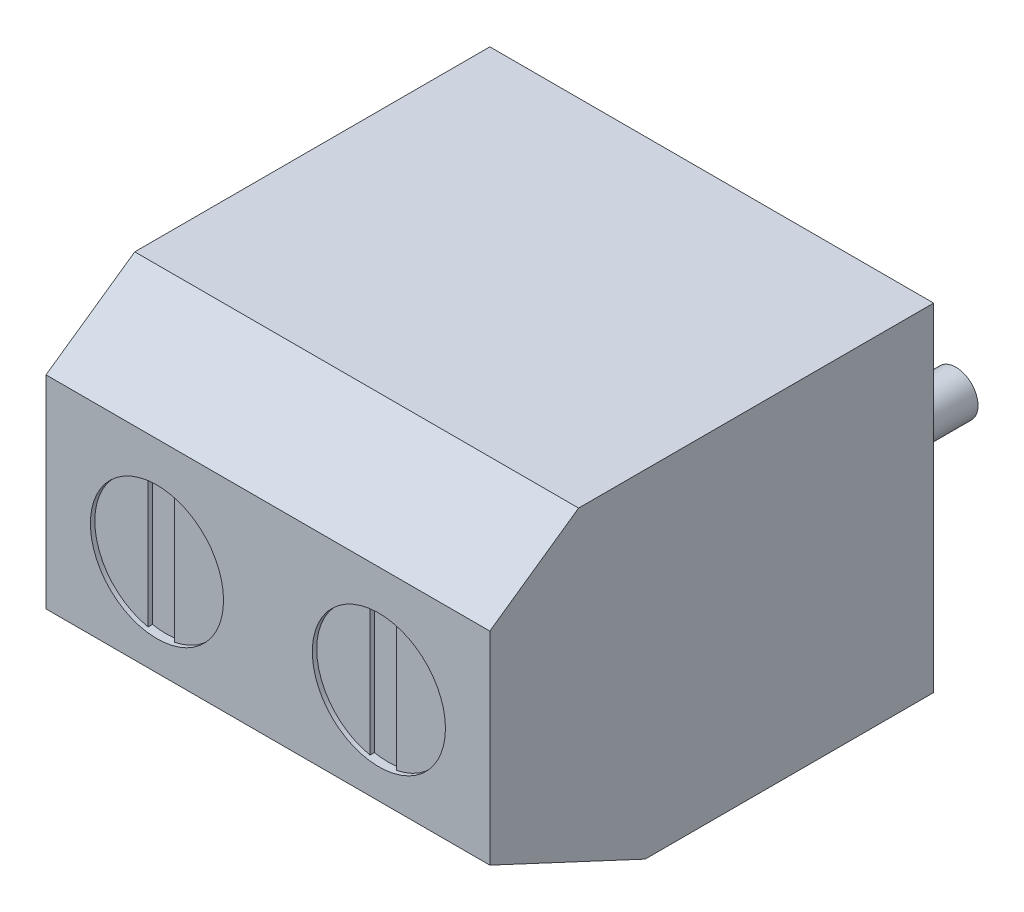
ISO-10303-21;
HEADER;
FILE_DESCRIPTION(('STEP AP214'),'2;1');
FILE_NAME('part.step','',(''),(''),'','','');
FILE_SCHEMA(('AUTOMOTIVE_DESIGN { 1 0 10303 214 1 1 1 1 }'));
ENDSEC;
DATA;
#1=APPLICATION_CONTEXT('core data for automotive mechanical design processes');
#2=APPLICATION_PROTOCOL_DEFINITION('international standard','automotive_design',2000,#1);
#3=PRODUCT_CONTEXT('',#1,'mechanical');
#4=PRODUCT('Part','Part','',(#3));
#5=PRODUCT_RELATED_PRODUCT_CATEGORY('part','',(#4));
#6=PRODUCT_DEFINITION_FORMATION('','',#4);
#7=PRODUCT_DEFINITION_CONTEXT('part definition',#1,'design');
#8=PRODUCT_DEFINITION('design','',#6,#7);
#9=PRODUCT_DEFINITION_SHAPE('','',#8);
#10=(LENGTH_UNIT() NAMED_UNIT(*) SI_UNIT(.MILLI.,.METRE.));
#11=(NAMED_UNIT(*) PLANE_ANGLE_UNIT() SI_UNIT($,.RADIAN.));
#12=(NAMED_UNIT(*) SI_UNIT($,.STERADIAN.) SOLID_ANGLE_UNIT());
#13=UNCERTAINTY_MEASURE_WITH_UNIT(LENGTH_MEASURE(1.E-05),#10,'distance_accuracy_value','');
#14=(GEOMETRIC_REPRESENTATION_CONTEXT(3) GLOBAL_UNCERTAINTY_ASSIGNED_CONTEXT((#13)) GLOBAL_UNIT_ASSIGNED_CONTEXT((#10,
#11,#12)) REPRESENTATION_CONTEXT('',''));
#15=CARTESIAN_POINT('',(0.,0.,0.));
#16=DIRECTION('',(0.,0.,1.));
#17=DIRECTION('',(1.,0.,0.));
#18=AXIS2_PLACEMENT_3D('',#15,#16,#17);
#19=CARTESIAN_POINT('',(-2.5,0.,9.9));
#20=DIRECTION('',(0.,0.,1.));
#21=DIRECTION('',(1.,0.,0.));
#22=AXIS2_PLACEMENT_3D('',#19,#20,#21);
#23=PLANE('',#22);
#24=DIRECTION('',(0.,1.,0.));
#25=VECTOR('',#24,1.);
#26=CARTESIAN_POINT('',(-2.2,-1.46969384566991,9.9));
#27=LINE('',#26,#25);
#28=CARTESIAN_POINT('',(-2.2,-1.46969384566991,9.9));
#29=VERTEX_POINT('',#28);
#30=CARTESIAN_POINT('',(-2.2,1.46969384566991,9.9));
#31=VERTEX_POINT('',#30);
#32=EDGE_CURVE('E233',#29,#31,#27,.T.);
#33=ORIENTED_EDGE('',*,*,#32,.F.);
#34=CARTESIAN_POINT('',(-2.5,0.,9.9));
#35=DIRECTION('',(0.,0.,1.));
#36=DIRECTION('',(1.,0.,0.));
#37=AXIS2_PLACEMENT_3D('',#34,#35,#36);
#38=CIRCLE('',#37,1.5);
#39=EDGE_CURVE('E255',#29,#31,#38,.T.);
#40=ORIENTED_EDGE('',*,*,#39,.T.);
#41=EDGE_LOOP('',(#33,#40));
#42=FACE_BOUND('',#41,.T.);
#43=ADVANCED_FACE('F35',(#42),#23,.T.);
#44=CARTESIAN_POINT('',(2.5,0.,9.9));
#45=DIRECTION('',(0.,0.,1.));
#46=DIRECTION('',(1.,0.,0.));
#47=AXIS2_PLACEMENT_3D('',#44,#45,#46);
#48=PLANE('',#47);
#49=DIRECTION('',(0.,1.,0.));
#50=VECTOR('',#49,1.);
#51=CARTESIAN_POINT('',(2.8,-1.46969384566991,9.9));
#52=LINE('',#51,#50);
#53=CARTESIAN_POINT('',(2.8,-1.46969384566991,9.9));
#54=VERTEX_POINT('',#53);
#55=CARTESIAN_POINT('',(2.8,1.46969384566991,9.9));
#56=VERTEX_POINT('',#55);
#57=EDGE_CURVE('E304',#54,#56,#52,.T.);
#58=ORIENTED_EDGE('',*,*,#57,.F.);
#59=CARTESIAN_POINT('',(2.5,0.,9.9));
#60=DIRECTION('',(0.,0.,1.));
#61=DIRECTION('',(1.,0.,0.));
#62=AXIS2_PLACEMENT_3D('',#59,#60,#61);
#63=CIRCLE('',#62,1.5);
#64=EDGE_CURVE('E326',#54,#56,#63,.T.);
#65=ORIENTED_EDGE('',*,*,#64,.T.);
#66=EDGE_LOOP('',(#58,#65));
#67=FACE_BOUND('',#66,.T.);
#68=ADVANCED_FACE('F392',(#67),#48,.T.);
#69=CARTESIAN_POINT('',(5.,-3.8,10.));
#70=DIRECTION('',(-1.,0.,0.));
#71=DIRECTION('',(0.,0.,1.));
#72=AXIS2_PLACEMENT_3D('',#69,#70,#71);
#73=PLANE('',#72);
#74=DIRECTION('',(0.,0.,-1.));
#75=VECTOR('',#74,1.);
#76=CARTESIAN_POINT('',(5.,3.8,10.));
#77=LINE('',#76,#75);
#78=CARTESIAN_POINT('',(5.,3.8,7.99999999999999));
#79=VERTEX_POINT('',#78);
#80=CARTESIAN_POINT('',(5.,3.8,0.));
#81=VERTEX_POINT('',#80);
#82=EDGE_CURVE('E355',#79,#81,#77,.T.);
#83=ORIENTED_EDGE('',*,*,#82,.F.);
#84=DIRECTION('',(0.,0.573576436351044,-0.819152044288993));
#85=VECTOR('',#84,1.);
#86=CARTESIAN_POINT('',(5.,2.39958492358058,10.));
#87=LINE('',#86,#85);
#88=CARTESIAN_POINT('',(5.,2.39958492358058,10.));
#89=VERTEX_POINT('',#88);
#90=EDGE_CURVE('E11',#79,#89,#87,.F.);
#91=ORIENTED_EDGE('',*,*,#90,.T.);
#92=DIRECTION('',(0.,1.,0.));
#93=VECTOR('',#92,1.);
#94=CARTESIAN_POINT('',(5.,-3.8,10.));
#95=LINE('',#94,#93);
#96=CARTESIAN_POINT('',(5.,-2.1679231964575,10.));
#97=VERTEX_POINT('',#96);
#98=EDGE_CURVE('E332',#97,#89,#95,.T.);
#99=ORIENTED_EDGE('',*,*,#98,.F.);
#100=DIRECTION('',(0.,0.422618261740697,0.906307787036651));
#101=VECTOR('',#100,1.);
#102=CARTESIAN_POINT('',(5.,-2.1679231964575,10.));
#103=LINE('',#102,#101);
#104=CARTESIAN_POINT('',(5.,-3.8,6.49999999999997));
#105=VERTEX_POINT('',#104);
#106=EDGE_CURVE('E360',#97,#105,#103,.F.);
#107=ORIENTED_EDGE('',*,*,#106,.T.);
#108=DIRECTION('',(0.,0.,-1.));
#109=VECTOR('',#108,1.);
#110=CARTESIAN_POINT('',(5.,-3.8,10.));
#111=LINE('',#110,#109);
#112=CARTESIAN_POINT('',(5.,-3.8,0.));
#113=VERTEX_POINT('',#112);
#114=EDGE_CURVE('E338',#105,#113,#111,.T.);
#115=ORIENTED_EDGE('',*,*,#114,.T.);
#116=DIRECTION('',(0.,1.,0.));
#117=VECTOR('',#116,1.);
#118=CARTESIAN_POINT('',(5.,-3.8,0.));
#119=LINE('',#118,#117);
#120=EDGE_CURVE('E339',#113,#81,#119,.T.);
#121=ORIENTED_EDGE('',*,*,#120,.T.);
#122=EDGE_LOOP('',(#83,#91,#99,#107,#115,#121));
#123=FACE_BOUND('',#122,.T.);
#124=ADVANCED_FACE('F384',(#123),#73,.F.);
#125=CARTESIAN_POINT('',(-5.,3.8,10.));
#126=DIRECTION('',(0.,-1.,0.));
#127=DIRECTION('',(0.,0.,-1.));
#128=AXIS2_PLACEMENT_3D('',#125,#126,#127);
#129=PLANE('',#128);
#130=DIRECTION('',(0.,0.,-1.));
#131=VECTOR('',#130,1.);
#132=CARTESIAN_POINT('',(-5.,3.8,10.));
#133=LINE('',#132,#131);
#134=CARTESIAN_POINT('',(-5.,3.8,7.99999999999999));
#135=VERTEX_POINT('',#134);
#136=CARTESIAN_POINT('',(-5.,3.8,0.));
#137=VERTEX_POINT('',#136);
#138=EDGE_CURVE('E353',#135,#137,#133,.T.);
#139=ORIENTED_EDGE('',*,*,#138,.F.);
#140=DIRECTION('',(1.,0.,0.));
#141=VECTOR('',#140,1.);
#142=CARTESIAN_POINT('',(-5.,3.8,7.99999999999999));
#143=LINE('',#142,#141);
#144=EDGE_CURVE('E43',#135,#79,#143,.T.);
#145=ORIENTED_EDGE('',*,*,#144,.T.);
#146=ORIENTED_EDGE('',*,*,#82,.T.);
#147=DIRECTION('',(-1.,0.,0.));
#148=VECTOR('',#147,1.);
#149=CARTESIAN_POINT('',(-5.,3.8,0.));
#150=LINE('',#149,#148);
#151=EDGE_CURVE('E342',#81,#137,#150,.T.);
#152=ORIENTED_EDGE('',*,*,#151,.T.);
#153=EDGE_LOOP('',(#139,#145,#146,#152));
#154=FACE_BOUND('',#153,.T.);
#155=ADVANCED_FACE('F477',(#154),#129,.F.);
#156=CARTESIAN_POINT('',(-5.,-3.8,10.));
#157=DIRECTION('',(1.,0.,0.));
#158=DIRECTION('',(0.,0.,-1.));
#159=AXIS2_PLACEMENT_3D('',#156,#157,#158);
#160=PLANE('',#159);
#161=DIRECTION('',(0.,-1.,0.));
#162=VECTOR('',#161,1.);
#163=CARTESIAN_POINT('',(-5.,-3.8,10.));
#164=LINE('',#163,#162);
#165=CARTESIAN_POINT('',(-5.,2.39958492358058,10.));
#166=VERTEX_POINT('',#165);
#167=CARTESIAN_POINT('',(-5.,-2.1679231964575,10.));
#168=VERTEX_POINT('',#167);
#169=EDGE_CURVE('E335',#166,#168,#164,.T.);
#170=ORIENTED_EDGE('',*,*,#169,.F.);
#171=DIRECTION('',(0.,-0.573576436351044,0.819152044288993));
#172=VECTOR('',#171,1.);
#173=CARTESIAN_POINT('',(-5.,2.39958492358058,10.));
#174=LINE('',#173,#172);
#175=EDGE_CURVE('E57',#166,#135,#174,.F.);
#176=ORIENTED_EDGE('',*,*,#175,.T.);
#177=ORIENTED_EDGE('',*,*,#138,.T.);
#178=DIRECTION('',(0.,-1.,0.));
#179=VECTOR('',#178,1.);
#180=CARTESIAN_POINT('',(-5.,-3.8,0.));
#181=LINE('',#180,#179);
#182=CARTESIAN_POINT('',(-5.,-3.8,0.));
#183=VERTEX_POINT('',#182);
#184=EDGE_CURVE('E345',#137,#183,#181,.T.);
#185=ORIENTED_EDGE('',*,*,#184,.T.);
#186=DIRECTION('',(0.,0.,-1.));
#187=VECTOR('',#186,1.);
#188=CARTESIAN_POINT('',(-5.,-3.8,10.));
#189=LINE('',#188,#187);
#190=CARTESIAN_POINT('',(-5.,-3.8,6.49999999999997));
#191=VERTEX_POINT('',#190);
#192=EDGE_CURVE('E351',#191,#183,#189,.T.);
#193=ORIENTED_EDGE('',*,*,#192,.F.);
#194=DIRECTION('',(0.,-0.422618261740697,-0.906307787036651));
#195=VECTOR('',#194,1.);
#196=CARTESIAN_POINT('',(-5.,-2.1679231964575,10.));
#197=LINE('',#196,#195);
#198=EDGE_CURVE('E364',#191,#168,#197,.F.);
#199=ORIENTED_EDGE('',*,*,#198,.T.);
#200=EDGE_LOOP('',(#170,#176,#177,#185,#193,#199));
#201=FACE_BOUND('',#200,.T.);
#202=ADVANCED_FACE('F376',(#201),#160,.F.);
#203=CARTESIAN_POINT('',(-5.,-3.8,10.));
#204=DIRECTION('',(0.,1.,0.));
#205=DIRECTION('',(0.,0.,1.));
#206=AXIS2_PLACEMENT_3D('',#203,#204,#205);
#207=PLANE('',#206);
#208=DIRECTION('',(-1.,0.,0.));
#209=VECTOR('',#208,1.);
#210=CARTESIAN_POINT('',(-4.,-3.8,5.2));
#211=LINE('',#210,#209);
#212=CARTESIAN_POINT('',(-0.999999999999999,-3.8,5.2));
#213=VERTEX_POINT('',#212);
#214=CARTESIAN_POINT('',(-4.,-3.8,5.2));
#215=VERTEX_POINT('',#214);
#216=EDGE_CURVE('E218',#213,#215,#211,.T.);
#217=ORIENTED_EDGE('',*,*,#216,.F.);
#218=DIRECTION('',(0.,0.,1.));
#219=VECTOR('',#218,1.);
#220=CARTESIAN_POINT('',(-0.999999999999999,-3.8,5.2));
#221=LINE('',#220,#219);
#222=CARTESIAN_POINT('',(-0.999999999999998,-3.8,0.5));
#223=VERTEX_POINT('',#222);
#224=EDGE_CURVE('E189',#223,#213,#221,.T.);
#225=ORIENTED_EDGE('',*,*,#224,.F.);
#226=DIRECTION('',(1.,0.,0.));
#227=VECTOR('',#226,1.);
#228=CARTESIAN_POINT('',(-4.,-3.8,0.5));
#229=LINE('',#228,#227);
#230=CARTESIAN_POINT('',(-4.,-3.8,0.5));
#231=VERTEX_POINT('',#230);
#232=EDGE_CURVE('E206',#231,#223,#229,.T.);
#233=ORIENTED_EDGE('',*,*,#232,.F.);
#234=DIRECTION('',(0.,0.,-1.));
#235=VECTOR('',#234,1.);
#236=CARTESIAN_POINT('',(-4.,-3.8,5.2));
#237=LINE('',#236,#235);
#238=EDGE_CURVE('E209',#215,#231,#237,.T.);
#239=ORIENTED_EDGE('',*,*,#238,.F.);
#240=EDGE_LOOP('',(#217,#225,#233,#239));
#241=FACE_BOUND('',#240,.T.);
#242=DIRECTION('',(-1.,0.,0.));
#243=VECTOR('',#242,1.);
#244=CARTESIAN_POINT('',(1.,-3.8,5.2));
#245=LINE('',#244,#243);
#246=CARTESIAN_POINT('',(4.,-3.8,5.2));
#247=VERTEX_POINT('',#246);
#248=CARTESIAN_POINT('',(1.,-3.8,5.2));
#249=VERTEX_POINT('',#248);
#250=EDGE_CURVE('E283',#247,#249,#245,.T.);
#251=ORIENTED_EDGE('',*,*,#250,.F.);
#252=DIRECTION('',(0.,0.,1.));
#253=VECTOR('',#252,1.);
#254=CARTESIAN_POINT('',(4.,-3.8,5.2));
#255=LINE('',#254,#253);
#256=CARTESIAN_POINT('',(4.,-3.8,0.5));
#257=VERTEX_POINT('',#256);
#258=EDGE_CURVE('E264',#257,#247,#255,.T.);
#259=ORIENTED_EDGE('',*,*,#258,.F.);
#260=DIRECTION('',(1.,0.,0.));
#261=VECTOR('',#260,1.);
#262=CARTESIAN_POINT('',(1.,-3.8,0.5));
#263=LINE('',#262,#261);
#264=CARTESIAN_POINT('',(1.,-3.8,0.5));
#265=VERTEX_POINT('',#264);
#266=EDGE_CURVE('E272',#265,#257,#263,.T.);
#267=ORIENTED_EDGE('',*,*,#266,.F.);
#268=DIRECTION('',(0.,0.,-1.));
#269=VECTOR('',#268,1.);
#270=CARTESIAN_POINT('',(1.,-3.8,5.2));
#271=LINE('',#270,#269);
#272=EDGE_CURVE('E286',#249,#265,#271,.T.);
#273=ORIENTED_EDGE('',*,*,#272,.F.);
#274=EDGE_LOOP('',(#251,#259,#267,#273));
#275=FACE_BOUND('',#274,.T.);
#276=ORIENTED_EDGE('',*,*,#114,.F.);
#277=DIRECTION('',(-1.,0.,0.));
#278=VECTOR('',#277,1.);
#279=CARTESIAN_POINT('',(-5.,-3.8,6.49999999999997));
#280=LINE('',#279,#278);
#281=EDGE_CURVE('E362',#105,#191,#280,.T.);
#282=ORIENTED_EDGE('',*,*,#281,.T.);
#283=ORIENTED_EDGE('',*,*,#192,.T.);
#284=DIRECTION('',(1.,0.,0.));
#285=VECTOR('',#284,1.);
#286=CARTESIAN_POINT('',(-5.,-3.8,0.));
#287=LINE('',#286,#285);
#288=EDGE_CURVE('E336',#183,#113,#287,.T.);
#289=ORIENTED_EDGE('',*,*,#288,.T.);
#290=EDGE_LOOP('',(#276,#282,#283,#289));
#291=FACE_BOUND('',#290,.T.);
#292=ADVANCED_FACE('F476',(#241,#275,#291),#207,.F.);
#293=CARTESIAN_POINT('',(0.,0.,10.));
#294=DIRECTION('',(0.,0.,-1.));
#295=DIRECTION('',(-1.,0.,0.));
#296=AXIS2_PLACEMENT_3D('',#293,#294,#295);
#297=PLANE('',#296);
#298=CARTESIAN_POINT('',(-2.5,0.,10.));
#299=DIRECTION('',(0.,0.,1.));
#300=DIRECTION('',(1.,0.,0.));
#301=AXIS2_PLACEMENT_3D('',#298,#299,#300);
#302=CIRCLE('',#301,1.5);
#303=CARTESIAN_POINT('',(-0.999999999999998,0.,10.));
#304=VERTEX_POINT('',#303);
#305=EDGE_CURVE('E249',#304,#304,#302,.T.);
#306=ORIENTED_EDGE('',*,*,#305,.F.);
#307=EDGE_LOOP('',(#306));
#308=FACE_BOUND('',#307,.T.);
#309=CARTESIAN_POINT('',(2.5,0.,10.));
#310=DIRECTION('',(0.,0.,1.));
#311=DIRECTION('',(1.,0.,0.));
#312=AXIS2_PLACEMENT_3D('',#309,#310,#311);
#313=CIRCLE('',#312,1.5);
#314=CARTESIAN_POINT('',(4.,0.,10.));
#315=VERTEX_POINT('',#314);
#316=EDGE_CURVE('E320',#315,#315,#313,.T.);
#317=ORIENTED_EDGE('',*,*,#316,.F.);
#318=EDGE_LOOP('',(#317));
#319=FACE_BOUND('',#318,.T.);
#320=ORIENTED_EDGE('',*,*,#98,.T.);
#321=DIRECTION('',(-1.,0.,0.));
#322=VECTOR('',#321,1.);
#323=CARTESIAN_POINT('',(0.,2.39958492358058,10.));
#324=LINE('',#323,#322);
#325=EDGE_CURVE('E367',#89,#166,#324,.T.);
#326=ORIENTED_EDGE('',*,*,#325,.T.);
#327=ORIENTED_EDGE('',*,*,#169,.T.);
#328=DIRECTION('',(1.,0.,0.));
#329=VECTOR('',#328,1.);
#330=CARTESIAN_POINT('',(0.,-2.1679231964575,10.));
#331=LINE('',#330,#329);
#332=EDGE_CURVE('E357',#168,#97,#331,.T.);
#333=ORIENTED_EDGE('',*,*,#332,.T.);
#334=EDGE_LOOP('',(#320,#326,#327,#333));
#335=FACE_BOUND('',#334,.T.);
#336=ADVANCED_FACE('F372',(#308,#319,#335),#297,.F.);
#337=CARTESIAN_POINT('',(0.,0.,0.));
#338=DIRECTION('',(0.,0.,-1.));
#339=DIRECTION('',(-1.,0.,0.));
#340=AXIS2_PLACEMENT_3D('',#337,#338,#339);
#341=PLANE('',#340);
#342=CARTESIAN_POINT('',(-2.5,-0.699999999999999,0.));
#343=DIRECTION('',(0.,0.,-1.));
#344=DIRECTION('',(-1.,0.,0.));
#345=AXIS2_PLACEMENT_3D('',#342,#343,#344);
#346=CIRCLE('',#345,0.5);
#347=CARTESIAN_POINT('',(-3.,-0.699999999999999,0.));
#348=VERTEX_POINT('',#347);
#349=EDGE_CURVE('E212',#348,#348,#346,.T.);
#350=ORIENTED_EDGE('',*,*,#349,.F.);
#351=EDGE_LOOP('',(#350));
#352=FACE_BOUND('',#351,.T.);
#353=CARTESIAN_POINT('',(2.5,-0.699999999999999,0.));
#354=DIRECTION('',(0.,0.,-1.));
#355=DIRECTION('',(-1.,0.,0.));
#356=AXIS2_PLACEMENT_3D('',#353,#354,#355);
#357=CIRCLE('',#356,0.5);
#358=CARTESIAN_POINT('',(2.,-0.699999999999999,0.));
#359=VERTEX_POINT('',#358);
#360=EDGE_CURVE('E265',#359,#359,#357,.T.);
#361=ORIENTED_EDGE('',*,*,#360,.F.);
#362=EDGE_LOOP('',(#361));
#363=FACE_BOUND('',#362,.T.);
#364=ORIENTED_EDGE('',*,*,#120,.F.);
#365=ORIENTED_EDGE('',*,*,#288,.F.);
#366=ORIENTED_EDGE('',*,*,#184,.F.);
#367=ORIENTED_EDGE('',*,*,#151,.F.);
#368=EDGE_LOOP('',(#364,#365,#366,#367));
#369=FACE_BOUND('',#368,.T.);
#370=ADVANCED_FACE('F464',(#352,#363,#369),#341,.T.);
#371=CARTESIAN_POINT('',(2.5,0.,9.9));
#372=DIRECTION('',(0.,0.,1.));
#373=DIRECTION('',(1.,0.,0.));
#374=AXIS2_PLACEMENT_3D('',#371,#372,#373);
#375=CYLINDRICAL_SURFACE('',#374,1.5);
#376=CARTESIAN_POINT('',(2.2,1.46969384566991,9.9));
#377=VERTEX_POINT('',#376);
#378=CARTESIAN_POINT('',(2.2,-1.46969384566991,9.9));
#379=VERTEX_POINT('',#378);
#380=EDGE_CURVE('E329',#377,#379,#63,.T.);
#381=ORIENTED_EDGE('',*,*,#380,.F.);
#382=DIRECTION('',(0.,0.,1.));
#383=VECTOR('',#382,1.);
#384=CARTESIAN_POINT('',(2.2,1.46969384566991,9.8));
#385=LINE('',#384,#383);
#386=CARTESIAN_POINT('',(2.2,1.46969384566991,9.8));
#387=VERTEX_POINT('',#386);
#388=EDGE_CURVE('E313',#387,#377,#385,.T.);
#389=ORIENTED_EDGE('',*,*,#388,.F.);
#390=CARTESIAN_POINT('',(2.5,0.,9.8));
#391=DIRECTION('',(0.,0.,1.));
#392=DIRECTION('',(-1.,0.,0.));
#393=AXIS2_PLACEMENT_3D('',#390,#391,#392);
#394=CIRCLE('',#393,1.5);
#395=CARTESIAN_POINT('',(2.8,1.46969384566991,9.8));
#396=VERTEX_POINT('',#395);
#397=EDGE_CURVE('E300',#396,#387,#394,.T.);
#398=ORIENTED_EDGE('',*,*,#397,.F.);
#399=DIRECTION('',(0.,0.,1.));
#400=VECTOR('',#399,1.);
#401=CARTESIAN_POINT('',(2.8,1.46969384566991,9.8));
#402=LINE('',#401,#400);
#403=EDGE_CURVE('E318',#396,#56,#402,.T.);
#404=ORIENTED_EDGE('',*,*,#403,.T.);
#405=ORIENTED_EDGE('',*,*,#64,.F.);
#406=DIRECTION('',(0.,0.,1.));
#407=VECTOR('',#406,1.);
#408=CARTESIAN_POINT('',(2.8,-1.46969384566991,9.8));
#409=LINE('',#408,#407);
#410=CARTESIAN_POINT('',(2.8,-1.46969384566991,9.8));
#411=VERTEX_POINT('',#410);
#412=EDGE_CURVE('E321',#411,#54,#409,.T.);
#413=ORIENTED_EDGE('',*,*,#412,.F.);
#414=CARTESIAN_POINT('',(2.5,0.,9.8));
#415=DIRECTION('',(0.,0.,1.));
#416=DIRECTION('',(1.,0.,0.));
#417=AXIS2_PLACEMENT_3D('',#414,#415,#416);
#418=CIRCLE('',#417,1.5);
#419=CARTESIAN_POINT('',(2.2,-1.46969384566991,9.8));
#420=VERTEX_POINT('',#419);
#421=EDGE_CURVE('E307',#420,#411,#418,.T.);
#422=ORIENTED_EDGE('',*,*,#421,.F.);
#423=DIRECTION('',(0.,0.,1.));
#424=VECTOR('',#423,1.);
#425=CARTESIAN_POINT('',(2.2,-1.46969384566991,9.8));
#426=LINE('',#425,#424);
#427=EDGE_CURVE('E323',#420,#379,#426,.T.);
#428=ORIENTED_EDGE('',*,*,#427,.T.);
#429=EDGE_LOOP('',(#381,#389,#398,#404,#405,#413,#422,#428));
#430=FACE_BOUND('',#429,.T.);
#431=ORIENTED_EDGE('',*,*,#316,.T.);
#432=EDGE_LOOP('',(#431));
#433=FACE_BOUND('',#432,.T.);
#434=ADVANCED_FACE('F467',(#430,#433),#375,.F.);
#435=DIRECTION('',(0.,-1.,0.));
#436=VECTOR('',#435,1.);
#437=CARTESIAN_POINT('',(2.2,-1.46969384566991,9.9));
#438=LINE('',#437,#436);
#439=EDGE_CURVE('E293',#377,#379,#438,.T.);
#440=ORIENTED_EDGE('',*,*,#439,.F.);
#441=ORIENTED_EDGE('',*,*,#380,.T.);
#442=EDGE_LOOP('',(#440,#441));
#443=FACE_BOUND('',#442,.T.);
#444=ADVANCED_FACE('F401',(#443),#48,.T.);
#445=CARTESIAN_POINT('',(2.8,-1.46969384566991,9.8));
#446=DIRECTION('',(1.,0.,0.));
#447=DIRECTION('',(0.,0.,-1.));
#448=AXIS2_PLACEMENT_3D('',#445,#446,#447);
#449=PLANE('',#448);
#450=ORIENTED_EDGE('',*,*,#57,.T.);
#451=ORIENTED_EDGE('',*,*,#403,.F.);
#452=DIRECTION('',(0.,1.,0.));
#453=VECTOR('',#452,1.);
#454=CARTESIAN_POINT('',(2.8,-1.46969384566991,9.8));
#455=LINE('',#454,#453);
#456=EDGE_CURVE('E310',#411,#396,#455,.T.);
#457=ORIENTED_EDGE('',*,*,#456,.F.);
#458=ORIENTED_EDGE('',*,*,#412,.T.);
#459=EDGE_LOOP('',(#450,#451,#457,#458));
#460=FACE_BOUND('',#459,.T.);
#461=ADVANCED_FACE('F497',(#460),#449,.F.);
#462=CARTESIAN_POINT('',(2.2,-1.46969384566991,9.8));
#463=DIRECTION('',(-1.,0.,0.));
#464=DIRECTION('',(0.,0.,1.));
#465=AXIS2_PLACEMENT_3D('',#462,#463,#464);
#466=PLANE('',#465);
#467=ORIENTED_EDGE('',*,*,#439,.T.);
#468=ORIENTED_EDGE('',*,*,#427,.F.);
#469=DIRECTION('',(0.,-1.,0.));
#470=VECTOR('',#469,1.);
#471=CARTESIAN_POINT('',(2.2,-1.46969384566991,9.8));
#472=LINE('',#471,#470);
#473=EDGE_CURVE('E303',#387,#420,#472,.T.);
#474=ORIENTED_EDGE('',*,*,#473,.F.);
#475=ORIENTED_EDGE('',*,*,#388,.T.);
#476=EDGE_LOOP('',(#467,#468,#474,#475));
#477=FACE_BOUND('',#476,.T.);
#478=ADVANCED_FACE('F499',(#477),#466,.F.);
#479=CARTESIAN_POINT('',(2.5,0.,9.8));
#480=DIRECTION('',(0.,0.,-1.));
#481=DIRECTION('',(-1.,0.,0.));
#482=AXIS2_PLACEMENT_3D('',#479,#480,#481);
#483=PLANE('',#482);
#484=ORIENTED_EDGE('',*,*,#397,.T.);
#485=ORIENTED_EDGE('',*,*,#473,.T.);
#486=ORIENTED_EDGE('',*,*,#421,.T.);
#487=ORIENTED_EDGE('',*,*,#456,.T.);
#488=EDGE_LOOP('',(#484,#485,#486,#487));
#489=FACE_BOUND('',#488,.T.);
#490=ADVANCED_FACE('F502',(#489),#483,.F.);
#491=CARTESIAN_POINT('',(4.,-1.8,5.2));
#492=DIRECTION('',(1.,0.,0.));
#493=DIRECTION('',(0.,0.,-1.));
#494=AXIS2_PLACEMENT_3D('',#491,#492,#493);
#495=PLANE('',#494);
#496=ORIENTED_EDGE('',*,*,#258,.T.);
#497=DIRECTION('',(0.,-1.,0.));
#498=VECTOR('',#497,1.);
#499=CARTESIAN_POINT('',(4.,-1.8,5.2));
#500=LINE('',#499,#498);
#501=CARTESIAN_POINT('',(4.,-1.8,5.2));
#502=VERTEX_POINT('',#501);
#503=EDGE_CURVE('E281',#502,#247,#500,.T.);
#504=ORIENTED_EDGE('',*,*,#503,.F.);
#505=DIRECTION('',(0.,0.,1.));
#506=VECTOR('',#505,1.);
#507=CARTESIAN_POINT('',(4.,-1.8,5.2));
#508=LINE('',#507,#506);
#509=CARTESIAN_POINT('',(4.,-1.8,0.5));
#510=VERTEX_POINT('',#509);
#511=EDGE_CURVE('E268',#510,#502,#508,.T.);
#512=ORIENTED_EDGE('',*,*,#511,.F.);
#513=DIRECTION('',(0.,-1.,0.));
#514=VECTOR('',#513,1.);
#515=CARTESIAN_POINT('',(4.,-1.8,0.5));
#516=LINE('',#515,#514);
#517=EDGE_CURVE('E291',#510,#257,#516,.T.);
#518=ORIENTED_EDGE('',*,*,#517,.T.);
#519=EDGE_LOOP('',(#496,#504,#512,#518));
#520=FACE_BOUND('',#519,.T.);
#521=ADVANCED_FACE('F509',(#520),#495,.F.);
#522=CARTESIAN_POINT('',(1.,-1.8,0.5));
#523=DIRECTION('',(0.,0.,-1.));
#524=DIRECTION('',(-1.,0.,0.));
#525=AXIS2_PLACEMENT_3D('',#522,#523,#524);
#526=PLANE('',#525);
#527=ORIENTED_EDGE('',*,*,#266,.T.);
#528=ORIENTED_EDGE('',*,*,#517,.F.);
#529=DIRECTION('',(1.,0.,0.));
#530=VECTOR('',#529,1.);
#531=CARTESIAN_POINT('',(1.,-1.8,0.5));
#532=LINE('',#531,#530);
#533=CARTESIAN_POINT('',(1.,-1.8,0.5));
#534=VERTEX_POINT('',#533);
#535=EDGE_CURVE('E278',#534,#510,#532,.T.);
#536=ORIENTED_EDGE('',*,*,#535,.F.);
#537=DIRECTION('',(0.,-1.,0.));
#538=VECTOR('',#537,1.);
#539=CARTESIAN_POINT('',(1.,-1.8,0.5));
#540=LINE('',#539,#538);
#541=EDGE_CURVE('E294',#534,#265,#540,.T.);
#542=ORIENTED_EDGE('',*,*,#541,.T.);
#543=EDGE_LOOP('',(#527,#528,#536,#542));
#544=FACE_BOUND('',#543,.T.);
#545=ADVANCED_FACE('F513',(#544),#526,.F.);
#546=CARTESIAN_POINT('',(1.,-1.8,5.2));
#547=DIRECTION('',(-1.,0.,0.));
#548=DIRECTION('',(0.,0.,1.));
#549=AXIS2_PLACEMENT_3D('',#546,#547,#548);
#550=PLANE('',#549);
#551=ORIENTED_EDGE('',*,*,#272,.T.);
#552=ORIENTED_EDGE('',*,*,#541,.F.);
#553=DIRECTION('',(0.,0.,-1.));
#554=VECTOR('',#553,1.);
#555=CARTESIAN_POINT('',(1.,-1.8,5.2));
#556=LINE('',#555,#554);
#557=CARTESIAN_POINT('',(1.,-1.8,5.2));
#558=VERTEX_POINT('',#557);
#559=EDGE_CURVE('E275',#558,#534,#556,.T.);
#560=ORIENTED_EDGE('',*,*,#559,.F.);
#561=DIRECTION('',(0.,-1.,0.));
#562=VECTOR('',#561,1.);
#563=CARTESIAN_POINT('',(1.,-1.8,5.2));
#564=LINE('',#563,#562);
#565=EDGE_CURVE('E296',#558,#249,#564,.T.);
#566=ORIENTED_EDGE('',*,*,#565,.T.);
#567=EDGE_LOOP('',(#551,#552,#560,#566));
#568=FACE_BOUND('',#567,.T.);
#569=ADVANCED_FACE('F519',(#568),#550,.F.);
#570=CARTESIAN_POINT('',(1.,-1.8,5.2));
#571=DIRECTION('',(0.,0.,1.));
#572=DIRECTION('',(1.,0.,0.));
#573=AXIS2_PLACEMENT_3D('',#570,#571,#572);
#574=PLANE('',#573);
#575=ORIENTED_EDGE('',*,*,#250,.T.);
#576=ORIENTED_EDGE('',*,*,#565,.F.);
#577=DIRECTION('',(-1.,0.,0.));
#578=VECTOR('',#577,1.);
#579=CARTESIAN_POINT('',(1.,-1.8,5.2));
#580=LINE('',#579,#578);
#581=EDGE_CURVE('E271',#502,#558,#580,.T.);
#582=ORIENTED_EDGE('',*,*,#581,.F.);
#583=ORIENTED_EDGE('',*,*,#503,.T.);
#584=EDGE_LOOP('',(#575,#576,#582,#583));
#585=FACE_BOUND('',#584,.T.);
#586=ADVANCED_FACE('F515',(#585),#574,.F.);
#587=CARTESIAN_POINT('',(0.,-1.8,0.));
#588=DIRECTION('',(0.,-1.,0.));
#589=DIRECTION('',(0.,0.,-1.));
#590=AXIS2_PLACEMENT_3D('',#587,#588,#589);
#591=PLANE('',#590);
#592=ORIENTED_EDGE('',*,*,#511,.T.);
#593=ORIENTED_EDGE('',*,*,#581,.T.);
#594=ORIENTED_EDGE('',*,*,#559,.T.);
#595=ORIENTED_EDGE('',*,*,#535,.T.);
#596=EDGE_LOOP('',(#592,#593,#594,#595));
#597=FACE_BOUND('',#596,.T.);
#598=ADVANCED_FACE('F518',(#597),#591,.T.);
#599=CARTESIAN_POINT('',(2.5,-0.699999999999999,-3.));
#600=DIRECTION('',(0.,0.,1.));
#601=DIRECTION('',(1.,0.,0.));
#602=AXIS2_PLACEMENT_3D('',#599,#600,#601);
#603=CYLINDRICAL_SURFACE('',#602,0.5);
#604=CARTESIAN_POINT('',(2.5,-0.699999999999999,-3.));
#605=DIRECTION('',(0.,0.,-1.));
#606=DIRECTION('',(-1.,0.,0.));
#607=AXIS2_PLACEMENT_3D('',#604,#605,#606);
#608=CIRCLE('',#607,0.5);
#609=CARTESIAN_POINT('',(2.,-0.699999999999999,-3.));
#610=VERTEX_POINT('',#609);
#611=EDGE_CURVE('E261',#610,#610,#608,.T.);
#612=ORIENTED_EDGE('',*,*,#611,.F.);
#613=EDGE_LOOP('',(#612));
#614=FACE_BOUND('',#613,.T.);
#615=ORIENTED_EDGE('',*,*,#360,.T.);
#616=EDGE_LOOP('',(#615));
#617=FACE_BOUND('',#616,.T.);
#618=ADVANCED_FACE('F529',(#614,#617),#603,.T.);
#619=CARTESIAN_POINT('',(2.5,-0.699999999999999,-3.));
#620=DIRECTION('',(0.,0.,-1.));
#621=DIRECTION('',(-1.,0.,0.));
#622=AXIS2_PLACEMENT_3D('',#619,#620,#621);
#623=PLANE('',#622);
#624=ORIENTED_EDGE('',*,*,#611,.T.);
#625=EDGE_LOOP('',(#624));
#626=FACE_BOUND('',#625,.T.);
#627=ADVANCED_FACE('F416',(#626),#623,.T.);
#628=CARTESIAN_POINT('',(-2.5,0.,9.9));
#629=DIRECTION('',(0.,0.,1.));
#630=DIRECTION('',(1.,0.,0.));
#631=AXIS2_PLACEMENT_3D('',#628,#629,#630);
#632=CYLINDRICAL_SURFACE('',#631,1.5);
#633=CARTESIAN_POINT('',(-2.8,1.46969384566991,9.9));
#634=VERTEX_POINT('',#633);
#635=CARTESIAN_POINT('',(-2.8,-1.46969384566991,9.9));
#636=VERTEX_POINT('',#635);
#637=EDGE_CURVE('E258',#634,#636,#38,.T.);
#638=ORIENTED_EDGE('',*,*,#637,.F.);
#639=DIRECTION('',(0.,0.,1.));
#640=VECTOR('',#639,1.);
#641=CARTESIAN_POINT('',(-2.8,1.46969384566991,9.8));
#642=LINE('',#641,#640);
#643=CARTESIAN_POINT('',(-2.8,1.46969384566991,9.8));
#644=VERTEX_POINT('',#643);
#645=EDGE_CURVE('E242',#644,#634,#642,.T.);
#646=ORIENTED_EDGE('',*,*,#645,.F.);
#647=CARTESIAN_POINT('',(-2.5,0.,9.8));
#648=DIRECTION('',(0.,0.,1.));
#649=DIRECTION('',(-1.,0.,0.));
#650=AXIS2_PLACEMENT_3D('',#647,#648,#649);
#651=CIRCLE('',#650,1.5);
#652=CARTESIAN_POINT('',(-2.2,1.46969384566991,9.8));
#653=VERTEX_POINT('',#652);
#654=EDGE_CURVE('E229',#653,#644,#651,.T.);
#655=ORIENTED_EDGE('',*,*,#654,.F.);
#656=DIRECTION('',(0.,0.,1.));
#657=VECTOR('',#656,1.);
#658=CARTESIAN_POINT('',(-2.2,1.46969384566991,9.8));
#659=LINE('',#658,#657);
#660=EDGE_CURVE('E247',#653,#31,#659,.T.);
#661=ORIENTED_EDGE('',*,*,#660,.T.);
#662=ORIENTED_EDGE('',*,*,#39,.F.);
#663=DIRECTION('',(0.,0.,1.));
#664=VECTOR('',#663,1.);
#665=CARTESIAN_POINT('',(-2.2,-1.46969384566991,9.8));
#666=LINE('',#665,#664);
#667=CARTESIAN_POINT('',(-2.2,-1.46969384566991,9.8));
#668=VERTEX_POINT('',#667);
#669=EDGE_CURVE('E250',#668,#29,#666,.T.);
#670=ORIENTED_EDGE('',*,*,#669,.F.);
#671=CARTESIAN_POINT('',(-2.5,0.,9.8));
#672=DIRECTION('',(0.,0.,1.));
#673=DIRECTION('',(1.,0.,0.));
#674=AXIS2_PLACEMENT_3D('',#671,#672,#673);
#675=CIRCLE('',#674,1.5);
#676=CARTESIAN_POINT('',(-2.8,-1.46969384566991,9.8));
#677=VERTEX_POINT('',#676);
#678=EDGE_CURVE('E236',#677,#668,#675,.T.);
#679=ORIENTED_EDGE('',*,*,#678,.F.);
#680=DIRECTION('',(0.,0.,1.));
#681=VECTOR('',#680,1.);
#682=CARTESIAN_POINT('',(-2.8,-1.46969384566991,9.8));
#683=LINE('',#682,#681);
#684=EDGE_CURVE('E252',#677,#636,#683,.T.);
#685=ORIENTED_EDGE('',*,*,#684,.T.);
#686=EDGE_LOOP('',(#638,#646,#655,#661,#662,#670,#679,#685));
#687=FACE_BOUND('',#686,.T.);
#688=ORIENTED_EDGE('',*,*,#305,.T.);
#689=EDGE_LOOP('',(#688));
#690=FACE_BOUND('',#689,.T.);
#691=ADVANCED_FACE('F407',(#687,#690),#632,.F.);
#692=DIRECTION('',(0.,-1.,0.));
#693=VECTOR('',#692,1.);
#694=CARTESIAN_POINT('',(-2.8,-1.46969384566991,9.9));
#695=LINE('',#694,#693);
#696=EDGE_CURVE('E225',#634,#636,#695,.T.);
#697=ORIENTED_EDGE('',*,*,#696,.F.);
#698=ORIENTED_EDGE('',*,*,#637,.T.);
#699=EDGE_LOOP('',(#697,#698));
#700=FACE_BOUND('',#699,.T.);
#701=ADVANCED_FACE('F395',(#700),#23,.T.);
#702=CARTESIAN_POINT('',(-2.2,-1.46969384566991,9.8));
#703=DIRECTION('',(1.,0.,0.));
#704=DIRECTION('',(0.,0.,-1.));
#705=AXIS2_PLACEMENT_3D('',#702,#703,#704);
#706=PLANE('',#705);
#707=ORIENTED_EDGE('',*,*,#32,.T.);
#708=ORIENTED_EDGE('',*,*,#660,.F.);
#709=DIRECTION('',(0.,1.,0.));
#710=VECTOR('',#709,1.);
#711=CARTESIAN_POINT('',(-2.2,-1.46969384566991,9.8));
#712=LINE('',#711,#710);
#713=EDGE_CURVE('E239',#668,#653,#712,.T.);
#714=ORIENTED_EDGE('',*,*,#713,.F.);
#715=ORIENTED_EDGE('',*,*,#669,.T.);
#716=EDGE_LOOP('',(#707,#708,#714,#715));
#717=FACE_BOUND('',#716,.T.);
#718=ADVANCED_FACE('F406',(#717),#706,.F.);
#719=CARTESIAN_POINT('',(-2.8,-1.46969384566991,9.8));
#720=DIRECTION('',(-1.,0.,0.));
#721=DIRECTION('',(0.,0.,1.));
#722=AXIS2_PLACEMENT_3D('',#719,#720,#721);
#723=PLANE('',#722);
#724=ORIENTED_EDGE('',*,*,#696,.T.);
#725=ORIENTED_EDGE('',*,*,#684,.F.);
#726=DIRECTION('',(0.,-1.,0.));
#727=VECTOR('',#726,1.);
#728=CARTESIAN_POINT('',(-2.8,-1.46969384566991,9.8));
#729=LINE('',#728,#727);
#730=EDGE_CURVE('E232',#644,#677,#729,.T.);
#731=ORIENTED_EDGE('',*,*,#730,.F.);
#732=ORIENTED_EDGE('',*,*,#645,.T.);
#733=EDGE_LOOP('',(#724,#725,#731,#732));
#734=FACE_BOUND('',#733,.T.);
#735=ADVANCED_FACE('F413',(#734),#723,.F.);
#736=CARTESIAN_POINT('',(-2.5,0.,9.8));
#737=DIRECTION('',(0.,0.,-1.));
#738=DIRECTION('',(-1.,0.,0.));
#739=AXIS2_PLACEMENT_3D('',#736,#737,#738);
#740=PLANE('',#739);
#741=ORIENTED_EDGE('',*,*,#654,.T.);
#742=ORIENTED_EDGE('',*,*,#730,.T.);
#743=ORIENTED_EDGE('',*,*,#678,.T.);
#744=ORIENTED_EDGE('',*,*,#713,.T.);
#745=EDGE_LOOP('',(#741,#742,#743,#744));
#746=FACE_BOUND('',#745,.T.);
#747=ADVANCED_FACE('F427',(#746),#740,.F.);
#748=CARTESIAN_POINT('',(-0.999999999999999,-1.8,5.2));
#749=DIRECTION('',(1.,0.,0.));
#750=DIRECTION('',(0.,0.,-1.));
#751=AXIS2_PLACEMENT_3D('',#748,#749,#750);
#752=PLANE('',#751);
#753=ORIENTED_EDGE('',*,*,#224,.T.);
#754=DIRECTION('',(0.,-1.,0.));
#755=VECTOR('',#754,1.);
#756=CARTESIAN_POINT('',(-0.999999999999999,-1.8,5.2));
#757=LINE('',#756,#755);
#758=CARTESIAN_POINT('',(-0.999999999999999,-1.8,5.2));
#759=VERTEX_POINT('',#758);
#760=EDGE_CURVE('E182',#759,#213,#757,.T.);
#761=ORIENTED_EDGE('',*,*,#760,.F.);
#762=DIRECTION('',(0.,0.,1.));
#763=VECTOR('',#762,1.);
#764=CARTESIAN_POINT('',(-0.999999999999999,-1.8,5.2));
#765=LINE('',#764,#763);
#766=CARTESIAN_POINT('',(-0.999999999999998,-1.8,0.5));
#767=VERTEX_POINT('',#766);
#768=EDGE_CURVE('E186',#767,#759,#765,.T.);
#769=ORIENTED_EDGE('',*,*,#768,.F.);
#770=DIRECTION('',(0.,-1.,0.));
#771=VECTOR('',#770,1.);
#772=CARTESIAN_POINT('',(-0.999999999999998,-1.8,0.5));
#773=LINE('',#772,#771);
#774=EDGE_CURVE('E223',#767,#223,#773,.T.);
#775=ORIENTED_EDGE('',*,*,#774,.T.);
#776=EDGE_LOOP('',(#753,#761,#769,#775));
#777=FACE_BOUND('',#776,.T.);
#778=ADVANCED_FACE('F184',(#777),#752,.F.);
#779=CARTESIAN_POINT('',(-4.,-1.8,0.5));
#780=DIRECTION('',(0.,0.,-1.));
#781=DIRECTION('',(-1.,0.,0.));
#782=AXIS2_PLACEMENT_3D('',#779,#780,#781);
#783=PLANE('',#782);
#784=ORIENTED_EDGE('',*,*,#232,.T.);
#785=ORIENTED_EDGE('',*,*,#774,.F.);
#786=DIRECTION('',(1.,0.,0.));
#787=VECTOR('',#786,1.);
#788=CARTESIAN_POINT('',(-4.,-1.8,0.5));
#789=LINE('',#788,#787);
#790=CARTESIAN_POINT('',(-4.,-1.8,0.5));
#791=VERTEX_POINT('',#790);
#792=EDGE_CURVE('E194',#791,#767,#789,.T.);
#793=ORIENTED_EDGE('',*,*,#792,.F.);
#794=DIRECTION('',(0.,-1.,0.));
#795=VECTOR('',#794,1.);
#796=CARTESIAN_POINT('',(-4.,-1.8,0.5));
#797=LINE('',#796,#795);
#798=EDGE_CURVE('E226',#791,#231,#797,.T.);
#799=ORIENTED_EDGE('',*,*,#798,.T.);
#800=EDGE_LOOP('',(#784,#785,#793,#799));
#801=FACE_BOUND('',#800,.T.);
#802=ADVANCED_FACE('F436',(#801),#783,.F.);
#803=CARTESIAN_POINT('',(-4.,-1.8,5.2));
#804=DIRECTION('',(-1.,0.,0.));
#805=DIRECTION('',(0.,0.,1.));
#806=AXIS2_PLACEMENT_3D('',#803,#804,#805);
#807=PLANE('',#806);
#808=ORIENTED_EDGE('',*,*,#238,.T.);
#809=ORIENTED_EDGE('',*,*,#798,.F.);
#810=DIRECTION('',(0.,0.,-1.));
#811=VECTOR('',#810,1.);
#812=CARTESIAN_POINT('',(-4.,-1.8,5.2));
#813=LINE('',#812,#811);
#814=CARTESIAN_POINT('',(-4.,-1.8,5.2));
#815=VERTEX_POINT('',#814);
#816=EDGE_CURVE('E202',#815,#791,#813,.T.);
#817=ORIENTED_EDGE('',*,*,#816,.F.);
#818=DIRECTION('',(0.,-1.,0.));
#819=VECTOR('',#818,1.);
#820=CARTESIAN_POINT('',(-4.,-1.8,5.2));
#821=LINE('',#820,#819);
#822=EDGE_CURVE('E193',#815,#215,#821,.T.);
#823=ORIENTED_EDGE('',*,*,#822,.T.);
#824=EDGE_LOOP('',(#808,#809,#817,#823));
#825=FACE_BOUND('',#824,.T.);
#826=ADVANCED_FACE('F441',(#825),#807,.F.);
#827=CARTESIAN_POINT('',(-4.,-1.8,5.2));
#828=DIRECTION('',(0.,0.,1.));
#829=DIRECTION('',(1.,0.,0.));
#830=AXIS2_PLACEMENT_3D('',#827,#828,#829);
#831=PLANE('',#830);
#832=ORIENTED_EDGE('',*,*,#216,.T.);
#833=ORIENTED_EDGE('',*,*,#822,.F.);
#834=DIRECTION('',(-1.,0.,0.));
#835=VECTOR('',#834,1.);
#836=CARTESIAN_POINT('',(-4.,-1.8,5.2));
#837=LINE('',#836,#835);
#838=EDGE_CURVE('E197',#759,#815,#837,.T.);
#839=ORIENTED_EDGE('',*,*,#838,.F.);
#840=ORIENTED_EDGE('',*,*,#760,.T.);
#841=EDGE_LOOP('',(#832,#833,#839,#840));
#842=FACE_BOUND('',#841,.T.);
#843=ADVANCED_FACE('F198',(#842),#831,.F.);
#844=CARTESIAN_POINT('',(-5.,-1.8,0.));
#845=DIRECTION('',(0.,-1.,0.));
#846=DIRECTION('',(0.,0.,-1.));
#847=AXIS2_PLACEMENT_3D('',#844,#845,#846);
#848=PLANE('',#847);
#849=ORIENTED_EDGE('',*,*,#768,.T.);
#850=ORIENTED_EDGE('',*,*,#838,.T.);
#851=ORIENTED_EDGE('',*,*,#816,.T.);
#852=ORIENTED_EDGE('',*,*,#792,.T.);
#853=EDGE_LOOP('',(#849,#850,#851,#852));
#854=FACE_BOUND('',#853,.T.);
#855=ADVANCED_FACE('F204',(#854),#848,.T.);
#856=CARTESIAN_POINT('',(-2.5,-0.699999999999999,-3.));
#857=DIRECTION('',(0.,0.,1.));
#858=DIRECTION('',(1.,0.,0.));
#859=AXIS2_PLACEMENT_3D('',#856,#857,#858);
#860=CYLINDRICAL_SURFACE('',#859,0.5);
#861=CARTESIAN_POINT('',(-2.5,-0.699999999999999,-3.));
#862=DIRECTION('',(0.,0.,-1.));
#863=DIRECTION('',(-1.,0.,0.));
#864=AXIS2_PLACEMENT_3D('',#861,#862,#863);
#865=CIRCLE('',#864,0.5);
#866=CARTESIAN_POINT('',(-3.,-0.699999999999999,-3.));
#867=VERTEX_POINT('',#866);
#868=EDGE_CURVE('E219',#867,#867,#865,.T.);
#869=ORIENTED_EDGE('',*,*,#868,.F.);
#870=EDGE_LOOP('',(#869));
#871=FACE_BOUND('',#870,.T.);
#872=ORIENTED_EDGE('',*,*,#349,.T.);
#873=EDGE_LOOP('',(#872));
#874=FACE_BOUND('',#873,.T.);
#875=ADVANCED_FACE('F450',(#871,#874),#860,.T.);
#876=CARTESIAN_POINT('',(-2.5,-0.699999999999999,-3.));
#877=DIRECTION('',(0.,0.,-1.));
#878=DIRECTION('',(-1.,0.,0.));
#879=AXIS2_PLACEMENT_3D('',#876,#877,#878);
#880=PLANE('',#879);
#881=ORIENTED_EDGE('',*,*,#868,.T.);
#882=EDGE_LOOP('',(#881));
#883=FACE_BOUND('',#882,.T.);
#884=ADVANCED_FACE('F390',(#883),#880,.T.);
#885=CARTESIAN_POINT('',(0.,-2.1679231964575,10.));
#886=DIRECTION('',(0.,0.906307787036651,-0.422618261740697));
#887=DIRECTION('',(1.,0.,0.));
#888=AXIS2_PLACEMENT_3D('',#885,#886,#887);
#889=PLANE('',#888);
#890=ORIENTED_EDGE('',*,*,#198,.F.);
#891=ORIENTED_EDGE('',*,*,#281,.F.);
#892=ORIENTED_EDGE('',*,*,#106,.F.);
#893=ORIENTED_EDGE('',*,*,#332,.F.);
#894=EDGE_LOOP('',(#890,#891,#892,#893));
#895=FACE_BOUND('',#894,.T.);
#896=ADVANCED_FACE('F382',(#895),#889,.F.);
#897=CARTESIAN_POINT('',(0.,2.39958492358058,10.));
#898=DIRECTION('',(0.,-0.819152044288993,-0.573576436351044));
#899=DIRECTION('',(-1.,0.,0.));
#900=AXIS2_PLACEMENT_3D('',#897,#898,#899);
#901=PLANE('',#900);
#902=ORIENTED_EDGE('',*,*,#90,.F.);
#903=ORIENTED_EDGE('',*,*,#144,.F.);
#904=ORIENTED_EDGE('',*,*,#175,.F.);
#905=ORIENTED_EDGE('',*,*,#325,.F.);
#906=EDGE_LOOP('',(#902,#903,#904,#905));
#907=FACE_BOUND('',#906,.T.);
#908=ADVANCED_FACE('F37',(#907),#901,.F.);
#909=CLOSED_SHELL('',(#43,#68,#124,#155,#202,#292,#336,#370,#434,#444,#461,#478,#490,#521,#545,
#569,#586,#598,#618,#627,#691,#701,#718,#735,#747,#778,#802,#826,#843,#855,#875,#884,#896,#908));
#910=MANIFOLD_SOLID_BREP('B2',#909);
#911=ADVANCED_BREP_SHAPE_REPRESENTATION('',(#18,#910),#14);
#912=SHAPE_DEFINITION_REPRESENTATION(#9,#911);
ENDSEC;
END-ISO-10303-21;
